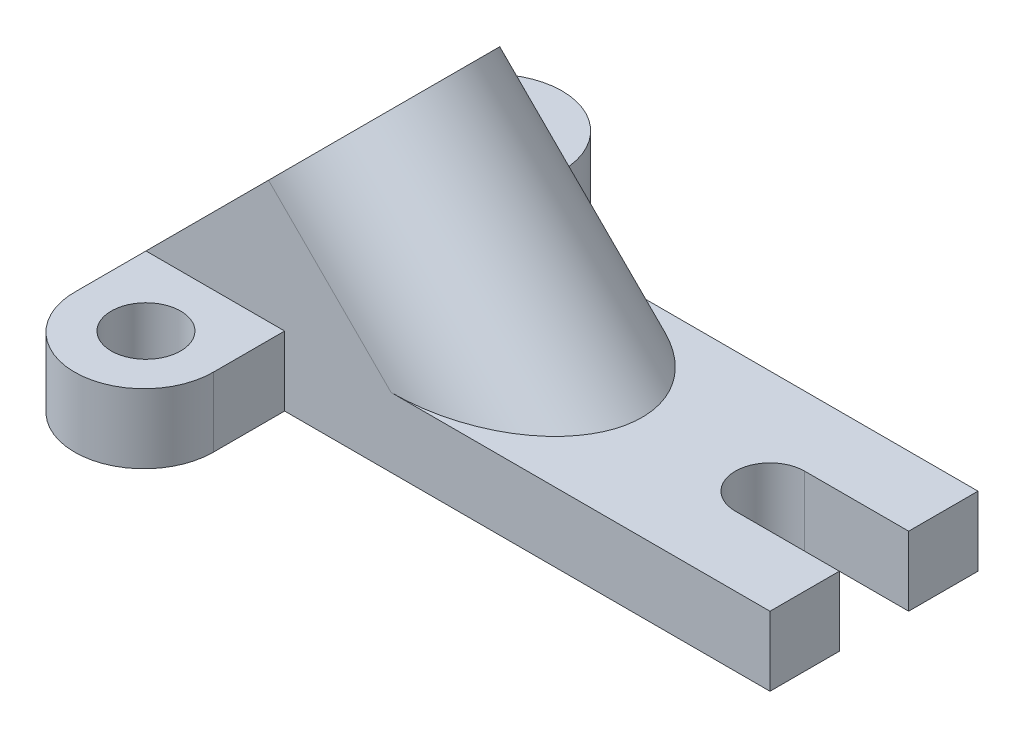
ISO-10303-21;
HEADER;
FILE_DESCRIPTION(('STEP AP214'),'2;1');
FILE_NAME('part.step','',(''),(''),'','','');
FILE_SCHEMA(('AUTOMOTIVE_DESIGN { 1 0 10303 214 1 1 1 1 }'));
ENDSEC;
DATA;
#1=APPLICATION_CONTEXT('core data for automotive mechanical design processes');
#2=APPLICATION_PROTOCOL_DEFINITION('international standard','automotive_design',2000,#1);
#3=PRODUCT_CONTEXT('',#1,'mechanical');
#4=PRODUCT('Part','Part','',(#3));
#5=PRODUCT_RELATED_PRODUCT_CATEGORY('part','',(#4));
#6=PRODUCT_DEFINITION_FORMATION('','',#4);
#7=PRODUCT_DEFINITION_CONTEXT('part definition',#1,'design');
#8=PRODUCT_DEFINITION('design','',#6,#7);
#9=PRODUCT_DEFINITION_SHAPE('','',#8);
#10=(LENGTH_UNIT() NAMED_UNIT(*) SI_UNIT(.MILLI.,.METRE.));
#11=(NAMED_UNIT(*) PLANE_ANGLE_UNIT() SI_UNIT($,.RADIAN.));
#12=(NAMED_UNIT(*) SI_UNIT($,.STERADIAN.) SOLID_ANGLE_UNIT());
#13=UNCERTAINTY_MEASURE_WITH_UNIT(LENGTH_MEASURE(1.E-05),#10,'distance_accuracy_value','');
#14=(GEOMETRIC_REPRESENTATION_CONTEXT(3) GLOBAL_UNCERTAINTY_ASSIGNED_CONTEXT((#13)) GLOBAL_UNIT_ASSIGNED_CONTEXT((#10,
#11,#12)) REPRESENTATION_CONTEXT('',''));
#15=CARTESIAN_POINT('',(0.,0.,0.));
#16=DIRECTION('',(0.,0.,1.));
#17=DIRECTION('',(1.,0.,0.));
#18=AXIS2_PLACEMENT_3D('',#15,#16,#17);
#19=CARTESIAN_POINT('',(140.,20.,-60.));
#20=DIRECTION('',(-1.,0.,0.));
#21=DIRECTION('',(0.,0.,1.));
#22=AXIS2_PLACEMENT_3D('',#19,#20,#21);
#23=PLANE('',#22);
#24=DIRECTION('',(0.,0.,-1.));
#25=VECTOR('',#24,1.);
#26=CARTESIAN_POINT('',(140.,0.,-60.));
#27=LINE('',#26,#25);
#28=CARTESIAN_POINT('',(140.,0.,0.));
#29=VERTEX_POINT('',#28);
#30=CARTESIAN_POINT('',(140.,0.,-20.));
#31=VERTEX_POINT('',#30);
#32=EDGE_CURVE('E173',#29,#31,#27,.T.);
#33=ORIENTED_EDGE('',*,*,#32,.T.);
#34=DIRECTION('',(0.,1.,0.));
#35=VECTOR('',#34,1.);
#36=CARTESIAN_POINT('',(140.,0.,-20.));
#37=LINE('',#36,#35);
#38=CARTESIAN_POINT('',(140.,20.,-20.));
#39=VERTEX_POINT('',#38);
#40=EDGE_CURVE('E157',#31,#39,#37,.T.);
#41=ORIENTED_EDGE('',*,*,#40,.T.);
#42=DIRECTION('',(0.,0.,-1.));
#43=VECTOR('',#42,1.);
#44=CARTESIAN_POINT('',(140.,20.,-60.));
#45=LINE('',#44,#43);
#46=CARTESIAN_POINT('',(140.,20.,0.));
#47=VERTEX_POINT('',#46);
#48=EDGE_CURVE('E277',#47,#39,#45,.T.);
#49=ORIENTED_EDGE('',*,*,#48,.F.);
#50=DIRECTION('',(0.,-1.,0.));
#51=VECTOR('',#50,1.);
#52=CARTESIAN_POINT('',(140.,20.,0.));
#53=LINE('',#52,#51);
#54=EDGE_CURVE('E181',#47,#29,#53,.T.);
#55=ORIENTED_EDGE('',*,*,#54,.T.);
#56=EDGE_LOOP('',(#33,#41,#49,#55));
#57=FACE_BOUND('',#56,.T.);
#58=ADVANCED_FACE('F47',(#57),#23,.F.);
#59=CARTESIAN_POINT('',(-20.0034741873056,20.,20.5636305457978));
#60=DIRECTION('',(0.,1.,0.));
#61=DIRECTION('',(0.,0.,1.));
#62=AXIS2_PLACEMENT_3D('',#59,#60,#61);
#63=PLANE('',#62);
#64=CARTESIAN_POINT('',(-19.9995037860271,20.,20.0000489442431));
#65=DIRECTION('',(0.,1.,0.));
#66=DIRECTION('',(0.,0.,1.));
#67=AXIS2_PLACEMENT_3D('',#64,#65,#66);
#68=CIRCLE('',#67,10.);
#69=CARTESIAN_POINT('',(-19.9995037860271,20.,30.0000489442431));
#70=VERTEX_POINT('',#69);
#71=EDGE_CURVE('E290',#70,#70,#68,.T.);
#72=ORIENTED_EDGE('',*,*,#71,.F.);
#73=EDGE_LOOP('',(#72));
#74=FACE_BOUND('',#73,.T.);
#75=DIRECTION('',(0.,0.,-1.));
#76=VECTOR('',#75,1.);
#77=CARTESIAN_POINT('',(0.,20.,0.));
#78=LINE('',#77,#76);
#79=CARTESIAN_POINT('',(0.,20.,20.5636305457978));
#80=VERTEX_POINT('',#79);
#81=CARTESIAN_POINT('',(0.,20.,0.));
#82=VERTEX_POINT('',#81);
#83=EDGE_CURVE('E207',#80,#82,#78,.T.);
#84=ORIENTED_EDGE('',*,*,#83,.T.);
#85=DIRECTION('',(-1.,0.,0.));
#86=VECTOR('',#85,1.);
#87=CARTESIAN_POINT('',(73.6406027347355,20.,0.));
#88=LINE('',#87,#86);
#89=CARTESIAN_POINT('',(-39.9990075720541,20.,0.));
#90=VERTEX_POINT('',#89);
#91=EDGE_CURVE('E11',#82,#90,#88,.T.);
#92=ORIENTED_EDGE('',*,*,#91,.T.);
#93=DIRECTION('',(0.,0.,1.));
#94=VECTOR('',#93,1.);
#95=CARTESIAN_POINT('',(-39.9990075720541,20.,-80.));
#96=LINE('',#95,#94);
#97=CARTESIAN_POINT('',(-39.9990075720541,20.,20.0000489442431));
#98=VERTEX_POINT('',#97);
#99=EDGE_CURVE('E266',#90,#98,#96,.T.);
#100=ORIENTED_EDGE('',*,*,#99,.T.);
#101=CARTESIAN_POINT('',(-20.0034741873056,20.,20.5636305457978));
#102=DIRECTION('',(0.,1.,0.));
#103=DIRECTION('',(0.,0.,1.));
#104=AXIS2_PLACEMENT_3D('',#101,#102,#103);
#105=CIRCLE('',#104,20.0034741873056);
#106=EDGE_CURVE('E213',#98,#80,#105,.T.);
#107=ORIENTED_EDGE('',*,*,#106,.T.);
#108=EDGE_LOOP('',(#84,#92,#100,#107));
#109=FACE_BOUND('',#108,.T.);
#110=ADVANCED_FACE('F465',(#74,#109),#63,.T.);
#111=CARTESIAN_POINT('',(-19.9995037860271,20.,-80.));
#112=DIRECTION('',(0.,1.,0.));
#113=DIRECTION('',(0.,0.,1.));
#114=AXIS2_PLACEMENT_3D('',#111,#112,#113);
#115=CIRCLE('',#114,10.);
#116=CARTESIAN_POINT('',(-19.9995037860271,20.,-70.));
#117=VERTEX_POINT('',#116);
#118=EDGE_CURVE('E257',#117,#117,#115,.T.);
#119=ORIENTED_EDGE('',*,*,#118,.F.);
#120=EDGE_LOOP('',(#119));
#121=FACE_BOUND('',#120,.T.);
#122=CARTESIAN_POINT('',(-39.9990075720541,20.,-80.));
#123=VERTEX_POINT('',#122);
#124=CARTESIAN_POINT('',(-39.9990075720541,20.,-60.));
#125=VERTEX_POINT('',#124);
#126=EDGE_CURVE('E262',#123,#125,#96,.T.);
#127=ORIENTED_EDGE('',*,*,#126,.T.);
#128=DIRECTION('',(1.,0.,0.));
#129=VECTOR('',#128,1.);
#130=CARTESIAN_POINT('',(73.6406027347355,20.,-60.));
#131=LINE('',#130,#129);
#132=CARTESIAN_POINT('',(0.,20.,-60.));
#133=VERTEX_POINT('',#132);
#134=EDGE_CURVE('E291',#125,#133,#131,.T.);
#135=ORIENTED_EDGE('',*,*,#134,.T.);
#136=DIRECTION('',(0.,0.,-1.));
#137=VECTOR('',#136,1.);
#138=CARTESIAN_POINT('',(0.,20.,-60.));
#139=LINE('',#138,#137);
#140=CARTESIAN_POINT('',(0.,20.,-80.));
#141=VERTEX_POINT('',#140);
#142=EDGE_CURVE('E270',#133,#141,#139,.T.);
#143=ORIENTED_EDGE('',*,*,#142,.T.);
#144=CARTESIAN_POINT('',(-19.9995037860271,20.,-80.));
#145=DIRECTION('',(0.,1.,0.));
#146=DIRECTION('',(0.,0.,-1.));
#147=AXIS2_PLACEMENT_3D('',#144,#145,#146);
#148=CIRCLE('',#147,19.9995037860271);
#149=EDGE_CURVE('E267',#141,#123,#148,.T.);
#150=ORIENTED_EDGE('',*,*,#149,.T.);
#151=EDGE_LOOP('',(#127,#135,#143,#150));
#152=FACE_BOUND('',#151,.T.);
#153=ADVANCED_FACE('F482',(#121,#152),#63,.T.);
#154=CARTESIAN_POINT('',(0.,20.,0.));
#155=DIRECTION('',(-1.,0.,0.));
#156=DIRECTION('',(0.,0.,1.));
#157=AXIS2_PLACEMENT_3D('',#154,#155,#156);
#158=PLANE('',#157);
#159=DIRECTION('',(0.,0.,-1.));
#160=VECTOR('',#159,1.);
#161=CARTESIAN_POINT('',(0.,0.,0.));
#162=LINE('',#161,#160);
#163=CARTESIAN_POINT('',(0.,0.,20.5636305457978));
#164=VERTEX_POINT('',#163);
#165=CARTESIAN_POINT('',(0.,0.,0.));
#166=VERTEX_POINT('',#165);
#167=EDGE_CURVE('E247',#164,#166,#162,.T.);
#168=ORIENTED_EDGE('',*,*,#167,.T.);
#169=DIRECTION('',(0.,-1.,0.));
#170=VECTOR('',#169,1.);
#171=CARTESIAN_POINT('',(0.,20.,0.));
#172=LINE('',#171,#170);
#173=EDGE_CURVE('E51',#82,#166,#172,.T.);
#174=ORIENTED_EDGE('',*,*,#173,.F.);
#175=ORIENTED_EDGE('',*,*,#83,.F.);
#176=DIRECTION('',(0.,-1.,0.));
#177=VECTOR('',#176,1.);
#178=CARTESIAN_POINT('',(0.,20.,20.5636305457978));
#179=LINE('',#178,#177);
#180=EDGE_CURVE('E208',#80,#164,#179,.T.);
#181=ORIENTED_EDGE('',*,*,#180,.T.);
#182=EDGE_LOOP('',(#168,#174,#175,#181));
#183=FACE_BOUND('',#182,.T.);
#184=ADVANCED_FACE('F49',(#183),#158,.F.);
#185=CARTESIAN_POINT('',(140.,20.,0.));
#186=DIRECTION('',(0.,0.,-1.));
#187=DIRECTION('',(-1.,0.,0.));
#188=AXIS2_PLACEMENT_3D('',#185,#186,#187);
#189=PLANE('',#188);
#190=DIRECTION('',(1.,0.,0.));
#191=VECTOR('',#190,1.);
#192=CARTESIAN_POINT('',(140.,0.,0.));
#193=LINE('',#192,#191);
#194=EDGE_CURVE('E192',#166,#29,#193,.T.);
#195=ORIENTED_EDGE('',*,*,#194,.T.);
#196=ORIENTED_EDGE('',*,*,#54,.F.);
#197=DIRECTION('',(1.,0.,0.));
#198=VECTOR('',#197,1.);
#199=CARTESIAN_POINT('',(140.,20.,0.));
#200=LINE('',#199,#198);
#201=CARTESIAN_POINT('',(30.7116705466007,20.,0.));
#202=VERTEX_POINT('',#201);
#203=EDGE_CURVE('E281',#202,#47,#200,.T.);
#204=ORIENTED_EDGE('',*,*,#203,.F.);
#205=DIRECTION('',(-0.707106781186549,0.707106781186546,0.));
#206=VECTOR('',#205,1.);
#207=CARTESIAN_POINT('',(108.995941794063,-58.2842712474618,0.));
#208=LINE('',#207,#206);
#209=CARTESIAN_POINT('',(-4.64366851272681,55.3553390593274,0.));
#210=VERTEX_POINT('',#209);
#211=EDGE_CURVE('E72',#202,#210,#208,.T.);
#212=ORIENTED_EDGE('',*,*,#211,.T.);
#213=DIRECTION('',(0.707106781186546,0.707106781186549,0.));
#214=VECTOR('',#213,1.);
#215=CARTESIAN_POINT('',(-39.9990075720541,20.,0.));
#216=LINE('',#215,#214);
#217=EDGE_CURVE('E301',#90,#210,#216,.T.);
#218=ORIENTED_EDGE('',*,*,#217,.F.);
#219=ORIENTED_EDGE('',*,*,#91,.F.);
#220=ORIENTED_EDGE('',*,*,#173,.T.);
#221=EDGE_LOOP('',(#195,#196,#204,#212,#218,#219,#220));
#222=FACE_BOUND('',#221,.T.);
#223=ADVANCED_FACE('F242',(#222),#189,.F.);
#224=CARTESIAN_POINT('',(140.,20.,-40.));
#225=VERTEX_POINT('',#224);
#226=CARTESIAN_POINT('',(140.,20.,-60.));
#227=VERTEX_POINT('',#226);
#228=EDGE_CURVE('E280',#225,#227,#45,.T.);
#229=ORIENTED_EDGE('',*,*,#228,.F.);
#230=DIRECTION('',(0.,1.,0.));
#231=VECTOR('',#230,1.);
#232=CARTESIAN_POINT('',(140.,0.,-40.));
#233=LINE('',#232,#231);
#234=CARTESIAN_POINT('',(140.,0.,-40.));
#235=VERTEX_POINT('',#234);
#236=EDGE_CURVE('E168',#235,#225,#233,.T.);
#237=ORIENTED_EDGE('',*,*,#236,.F.);
#238=CARTESIAN_POINT('',(140.,0.,-60.));
#239=VERTEX_POINT('',#238);
#240=EDGE_CURVE('E184',#235,#239,#27,.T.);
#241=ORIENTED_EDGE('',*,*,#240,.T.);
#242=DIRECTION('',(0.,-1.,0.));
#243=VECTOR('',#242,1.);
#244=CARTESIAN_POINT('',(140.,20.,-60.));
#245=LINE('',#244,#243);
#246=EDGE_CURVE('E229',#227,#239,#245,.T.);
#247=ORIENTED_EDGE('',*,*,#246,.F.);
#248=EDGE_LOOP('',(#229,#237,#241,#247));
#249=FACE_BOUND('',#248,.T.);
#250=ADVANCED_FACE('F362',(#249),#23,.F.);
#251=CARTESIAN_POINT('',(0.,20.,-60.));
#252=DIRECTION('',(0.,0.,1.));
#253=DIRECTION('',(1.,0.,0.));
#254=AXIS2_PLACEMENT_3D('',#251,#252,#253);
#255=PLANE('',#254);
#256=DIRECTION('',(-1.,0.,0.));
#257=VECTOR('',#256,1.);
#258=CARTESIAN_POINT('',(0.,0.,-60.));
#259=LINE('',#258,#257);
#260=CARTESIAN_POINT('',(0.,0.,-60.));
#261=VERTEX_POINT('',#260);
#262=EDGE_CURVE('E183',#239,#261,#259,.T.);
#263=ORIENTED_EDGE('',*,*,#262,.T.);
#264=DIRECTION('',(0.,-1.,0.));
#265=VECTOR('',#264,1.);
#266=CARTESIAN_POINT('',(0.,20.,-60.));
#267=LINE('',#266,#265);
#268=EDGE_CURVE('E225',#133,#261,#267,.T.);
#269=ORIENTED_EDGE('',*,*,#268,.F.);
#270=ORIENTED_EDGE('',*,*,#134,.F.);
#271=DIRECTION('',(-0.707106781186546,-0.707106781186549,0.));
#272=VECTOR('',#271,1.);
#273=CARTESIAN_POINT('',(-39.9990075720541,20.,-60.));
#274=LINE('',#273,#272);
#275=CARTESIAN_POINT('',(-4.6436685127268,55.3553390593274,-60.));
#276=VERTEX_POINT('',#275);
#277=EDGE_CURVE('E312',#276,#125,#274,.T.);
#278=ORIENTED_EDGE('',*,*,#277,.F.);
#279=DIRECTION('',(-0.707106781186549,0.707106781186546,0.));
#280=VECTOR('',#279,1.);
#281=CARTESIAN_POINT('',(108.995941794063,-58.2842712474618,-60.));
#282=LINE('',#281,#280);
#283=CARTESIAN_POINT('',(30.7116705466008,20.,-60.));
#284=VERTEX_POINT('',#283);
#285=EDGE_CURVE('E298',#284,#276,#282,.T.);
#286=ORIENTED_EDGE('',*,*,#285,.F.);
#287=DIRECTION('',(-1.,0.,0.));
#288=VECTOR('',#287,1.);
#289=CARTESIAN_POINT('',(0.,20.,-60.));
#290=LINE('',#289,#288);
#291=EDGE_CURVE('E273',#227,#284,#290,.T.);
#292=ORIENTED_EDGE('',*,*,#291,.F.);
#293=ORIENTED_EDGE('',*,*,#246,.T.);
#294=EDGE_LOOP('',(#263,#269,#270,#278,#286,#292,#293));
#295=FACE_BOUND('',#294,.T.);
#296=ADVANCED_FACE('F488',(#295),#255,.F.);
#297=CARTESIAN_POINT('',(0.,20.,-60.));
#298=DIRECTION('',(-1.,0.,0.));
#299=DIRECTION('',(0.,0.,1.));
#300=AXIS2_PLACEMENT_3D('',#297,#298,#299);
#301=PLANE('',#300);
#302=DIRECTION('',(0.,0.,-1.));
#303=VECTOR('',#302,1.);
#304=CARTESIAN_POINT('',(0.,0.,-60.));
#305=LINE('',#304,#303);
#306=CARTESIAN_POINT('',(0.,0.,-80.));
#307=VERTEX_POINT('',#306);
#308=EDGE_CURVE('E190',#261,#307,#305,.T.);
#309=ORIENTED_EDGE('',*,*,#308,.T.);
#310=DIRECTION('',(0.,-1.,0.));
#311=VECTOR('',#310,1.);
#312=CARTESIAN_POINT('',(0.,20.,-80.));
#313=LINE('',#312,#311);
#314=EDGE_CURVE('E221',#141,#307,#313,.T.);
#315=ORIENTED_EDGE('',*,*,#314,.F.);
#316=ORIENTED_EDGE('',*,*,#142,.F.);
#317=ORIENTED_EDGE('',*,*,#268,.T.);
#318=EDGE_LOOP('',(#309,#315,#316,#317));
#319=FACE_BOUND('',#318,.T.);
#320=ADVANCED_FACE('F486',(#319),#301,.F.);
#321=CARTESIAN_POINT('',(-19.9995037860271,20.,-80.));
#322=DIRECTION('',(0.,-1.,0.));
#323=DIRECTION('',(0.,0.,-1.));
#324=AXIS2_PLACEMENT_3D('',#321,#322,#323);
#325=CYLINDRICAL_SURFACE('',#324,19.9995037860271);
#326=CARTESIAN_POINT('',(-19.9995037860271,0.,-80.));
#327=DIRECTION('',(0.,1.,0.));
#328=DIRECTION('',(0.,0.,-1.));
#329=AXIS2_PLACEMENT_3D('',#326,#327,#328);
#330=CIRCLE('',#329,19.9995037860271);
#331=CARTESIAN_POINT('',(-39.9990075720541,0.,-80.));
#332=VERTEX_POINT('',#331);
#333=EDGE_CURVE('E198',#307,#332,#330,.T.);
#334=ORIENTED_EDGE('',*,*,#333,.T.);
#335=DIRECTION('',(0.,-1.,0.));
#336=VECTOR('',#335,1.);
#337=CARTESIAN_POINT('',(-39.9990075720541,20.,-80.));
#338=LINE('',#337,#336);
#339=EDGE_CURVE('E217',#123,#332,#338,.T.);
#340=ORIENTED_EDGE('',*,*,#339,.F.);
#341=ORIENTED_EDGE('',*,*,#149,.F.);
#342=ORIENTED_EDGE('',*,*,#314,.T.);
#343=EDGE_LOOP('',(#334,#340,#341,#342));
#344=FACE_BOUND('',#343,.T.);
#345=ADVANCED_FACE('F477',(#344),#325,.T.);
#346=CARTESIAN_POINT('',(-39.9990075720541,20.,-80.));
#347=DIRECTION('',(1.,0.,0.));
#348=DIRECTION('',(0.,0.,-1.));
#349=AXIS2_PLACEMENT_3D('',#346,#347,#348);
#350=PLANE('',#349);
#351=DIRECTION('',(0.,0.,1.));
#352=VECTOR('',#351,1.);
#353=CARTESIAN_POINT('',(-39.9990075720541,0.,-80.));
#354=LINE('',#353,#352);
#355=CARTESIAN_POINT('',(-39.9990075720541,0.,20.0000489442431));
#356=VERTEX_POINT('',#355);
#357=EDGE_CURVE('E201',#332,#356,#354,.T.);
#358=ORIENTED_EDGE('',*,*,#357,.T.);
#359=DIRECTION('',(0.,-1.,0.));
#360=VECTOR('',#359,1.);
#361=CARTESIAN_POINT('',(-39.9990075720541,20.,20.0000489442431));
#362=LINE('',#361,#360);
#363=EDGE_CURVE('E212',#98,#356,#362,.T.);
#364=ORIENTED_EDGE('',*,*,#363,.F.);
#365=ORIENTED_EDGE('',*,*,#99,.F.);
#366=DIRECTION('',(0.,0.,1.));
#367=VECTOR('',#366,1.);
#368=CARTESIAN_POINT('',(-39.9990075720541,20.,-60.));
#369=LINE('',#368,#367);
#370=EDGE_CURVE('E308',#125,#90,#369,.T.);
#371=ORIENTED_EDGE('',*,*,#370,.F.);
#372=ORIENTED_EDGE('',*,*,#126,.F.);
#373=ORIENTED_EDGE('',*,*,#339,.T.);
#374=EDGE_LOOP('',(#358,#364,#365,#371,#372,#373));
#375=FACE_BOUND('',#374,.T.);
#376=ADVANCED_FACE('F469',(#375),#350,.F.);
#377=CARTESIAN_POINT('',(-20.0034741873056,20.,20.5636305457978));
#378=DIRECTION('',(0.,-1.,0.));
#379=DIRECTION('',(0.,0.,-1.));
#380=AXIS2_PLACEMENT_3D('',#377,#378,#379);
#381=CYLINDRICAL_SURFACE('',#380,20.0034741873056);
#382=CARTESIAN_POINT('',(-20.0034741873056,0.,20.5636305457978));
#383=DIRECTION('',(0.,1.,0.));
#384=DIRECTION('',(0.,0.,1.));
#385=AXIS2_PLACEMENT_3D('',#382,#383,#384);
#386=CIRCLE('',#385,20.0034741873056);
#387=EDGE_CURVE('E204',#356,#164,#386,.T.);
#388=ORIENTED_EDGE('',*,*,#387,.T.);
#389=ORIENTED_EDGE('',*,*,#180,.F.);
#390=ORIENTED_EDGE('',*,*,#106,.F.);
#391=ORIENTED_EDGE('',*,*,#363,.T.);
#392=EDGE_LOOP('',(#388,#389,#390,#391));
#393=FACE_BOUND('',#392,.T.);
#394=ADVANCED_FACE('F472',(#393),#381,.T.);
#395=DIRECTION('',(1.,0.,0.));
#396=VECTOR('',#395,1.);
#397=CARTESIAN_POINT('',(140.,20.,-20.));
#398=LINE('',#397,#396);
#399=CARTESIAN_POINT('',(110.,20.,-20.));
#400=VERTEX_POINT('',#399);
#401=EDGE_CURVE('E162',#400,#39,#398,.T.);
#402=ORIENTED_EDGE('',*,*,#401,.F.);
#403=CARTESIAN_POINT('',(110.,20.,-30.));
#404=DIRECTION('',(0.,1.,0.));
#405=DIRECTION('',(0.,0.,-1.));
#406=AXIS2_PLACEMENT_3D('',#403,#404,#405);
#407=CIRCLE('',#406,10.);
#408=CARTESIAN_POINT('',(110.,20.,-40.));
#409=VERTEX_POINT('',#408);
#410=EDGE_CURVE('E177',#409,#400,#407,.T.);
#411=ORIENTED_EDGE('',*,*,#410,.F.);
#412=DIRECTION('',(-1.,0.,0.));
#413=VECTOR('',#412,1.);
#414=CARTESIAN_POINT('',(140.,20.,-40.));
#415=LINE('',#414,#413);
#416=EDGE_CURVE('E343',#225,#409,#415,.T.);
#417=ORIENTED_EDGE('',*,*,#416,.F.);
#418=ORIENTED_EDGE('',*,*,#228,.T.);
#419=ORIENTED_EDGE('',*,*,#291,.T.);
#420=CARTESIAN_POINT('',(30.7116705466007,20.,-30.));
#421=DIRECTION('',(0.,1.,0.));
#422=DIRECTION('',(-1.,0.,0.));
#423=AXIS2_PLACEMENT_3D('',#420,#421,#422);
#424=ELLIPSE('',#423,42.4264068711929,30.);
#425=EDGE_CURVE('E304',#284,#202,#424,.F.);
#426=ORIENTED_EDGE('',*,*,#425,.T.);
#427=ORIENTED_EDGE('',*,*,#203,.T.);
#428=ORIENTED_EDGE('',*,*,#48,.T.);
#429=EDGE_LOOP('',(#402,#411,#417,#418,#419,#426,#427,#428));
#430=FACE_BOUND('',#429,.T.);
#431=ADVANCED_FACE('F490',(#430),#63,.T.);
#432=CARTESIAN_POINT('',(-20.0034741873056,0.,20.5636305457978));
#433=DIRECTION('',(0.,1.,0.));
#434=DIRECTION('',(0.,0.,1.));
#435=AXIS2_PLACEMENT_3D('',#432,#433,#434);
#436=PLANE('',#435);
#437=CARTESIAN_POINT('',(50.7116705466008,0.,-30.));
#438=DIRECTION('',(0.,1.,0.));
#439=DIRECTION('',(-1.,0.,0.));
#440=AXIS2_PLACEMENT_3D('',#437,#438,#439);
#441=ELLIPSE('',#440,21.2132034355965,15.);
#442=CARTESIAN_POINT('',(29.4984671110043,0.,-30.));
#443=VERTEX_POINT('',#442);
#444=EDGE_CURVE('E319',#443,#443,#441,.F.);
#445=ORIENTED_EDGE('',*,*,#444,.F.);
#446=EDGE_LOOP('',(#445));
#447=FACE_BOUND('',#446,.T.);
#448=CARTESIAN_POINT('',(-19.9995037860271,0.,-80.));
#449=DIRECTION('',(0.,1.,0.));
#450=DIRECTION('',(0.,0.,1.));
#451=AXIS2_PLACEMENT_3D('',#448,#449,#450);
#452=CIRCLE('',#451,10.);
#453=CARTESIAN_POINT('',(-19.9995037860271,0.,-70.));
#454=VERTEX_POINT('',#453);
#455=EDGE_CURVE('E251',#454,#454,#452,.T.);
#456=ORIENTED_EDGE('',*,*,#455,.T.);
#457=EDGE_LOOP('',(#456));
#458=FACE_BOUND('',#457,.T.);
#459=CARTESIAN_POINT('',(-19.9995037860271,0.,20.0000489442431));
#460=DIRECTION('',(0.,1.,0.));
#461=DIRECTION('',(0.,0.,1.));
#462=AXIS2_PLACEMENT_3D('',#459,#460,#461);
#463=CIRCLE('',#462,10.);
#464=CARTESIAN_POINT('',(-19.9995037860271,0.,30.0000489442431));
#465=VERTEX_POINT('',#464);
#466=EDGE_CURVE('E286',#465,#465,#463,.T.);
#467=ORIENTED_EDGE('',*,*,#466,.T.);
#468=EDGE_LOOP('',(#467));
#469=FACE_BOUND('',#468,.T.);
#470=CARTESIAN_POINT('',(110.,0.,-30.));
#471=DIRECTION('',(0.,1.,0.));
#472=DIRECTION('',(0.,0.,-1.));
#473=AXIS2_PLACEMENT_3D('',#470,#471,#472);
#474=CIRCLE('',#473,10.);
#475=CARTESIAN_POINT('',(110.,0.,-40.));
#476=VERTEX_POINT('',#475);
#477=CARTESIAN_POINT('',(110.,0.,-20.));
#478=VERTEX_POINT('',#477);
#479=EDGE_CURVE('E64',#476,#478,#474,.T.);
#480=ORIENTED_EDGE('',*,*,#479,.T.);
#481=DIRECTION('',(1.,0.,0.));
#482=VECTOR('',#481,1.);
#483=CARTESIAN_POINT('',(140.,0.,-20.));
#484=LINE('',#483,#482);
#485=EDGE_CURVE('E160',#478,#31,#484,.T.);
#486=ORIENTED_EDGE('',*,*,#485,.T.);
#487=ORIENTED_EDGE('',*,*,#32,.F.);
#488=ORIENTED_EDGE('',*,*,#194,.F.);
#489=ORIENTED_EDGE('',*,*,#167,.F.);
#490=ORIENTED_EDGE('',*,*,#387,.F.);
#491=ORIENTED_EDGE('',*,*,#357,.F.);
#492=ORIENTED_EDGE('',*,*,#333,.F.);
#493=ORIENTED_EDGE('',*,*,#308,.F.);
#494=ORIENTED_EDGE('',*,*,#262,.F.);
#495=ORIENTED_EDGE('',*,*,#240,.F.);
#496=DIRECTION('',(-1.,0.,0.));
#497=VECTOR('',#496,1.);
#498=CARTESIAN_POINT('',(140.,0.,-40.));
#499=LINE('',#498,#497);
#500=EDGE_CURVE('E176',#235,#476,#499,.T.);
#501=ORIENTED_EDGE('',*,*,#500,.T.);
#502=EDGE_LOOP('',(#480,#486,#487,#488,#489,#490,#491,#492,#493,#494,#495,#501));
#503=FACE_BOUND('',#502,.T.);
#504=ADVANCED_FACE('F172',(#447,#458,#469,#503),#436,.F.);
#505=CARTESIAN_POINT('',(-19.9995037860271,0.,20.0000489442431));
#506=DIRECTION('',(0.,1.,0.));
#507=DIRECTION('',(0.,0.,1.));
#508=AXIS2_PLACEMENT_3D('',#505,#506,#507);
#509=CYLINDRICAL_SURFACE('',#508,10.);
#510=ORIENTED_EDGE('',*,*,#466,.F.);
#511=EDGE_LOOP('',(#510));
#512=FACE_BOUND('',#511,.T.);
#513=ORIENTED_EDGE('',*,*,#71,.T.);
#514=EDGE_LOOP('',(#513));
#515=FACE_BOUND('',#514,.T.);
#516=ADVANCED_FACE('F533',(#512,#515),#509,.F.);
#517=CARTESIAN_POINT('',(-19.9995037860271,0.,-80.));
#518=DIRECTION('',(0.,1.,0.));
#519=DIRECTION('',(0.,0.,1.));
#520=AXIS2_PLACEMENT_3D('',#517,#518,#519);
#521=CYLINDRICAL_SURFACE('',#520,10.);
#522=ORIENTED_EDGE('',*,*,#455,.F.);
#523=EDGE_LOOP('',(#522));
#524=FACE_BOUND('',#523,.T.);
#525=ORIENTED_EDGE('',*,*,#118,.T.);
#526=EDGE_LOOP('',(#525));
#527=FACE_BOUND('',#526,.T.);
#528=ADVANCED_FACE('F573',(#524,#527),#521,.F.);
#529=CARTESIAN_POINT('',(-4.64366851272683,55.3553390593274,-30.));
#530=DIRECTION('',(0.707106781186549,-0.707106781186546,0.));
#531=DIRECTION('',(0.707106781186546,0.707106781186549,0.));
#532=AXIS2_PLACEMENT_3D('',#529,#530,#531);
#533=PLANE('',#532);
#534=CARTESIAN_POINT('',(-4.64366851272682,55.3553390593274,-30.));
#535=DIRECTION('',(-0.707106781186549,0.707106781186546,0.));
#536=DIRECTION('',(-0.707106781186546,-0.707106781186549,0.));
#537=AXIS2_PLACEMENT_3D('',#534,#535,#536);
#538=CIRCLE('',#537,15.);
#539=CARTESIAN_POINT('',(-15.250270230525,44.7487373415292,-30.));
#540=VERTEX_POINT('',#539);
#541=EDGE_CURVE('E328',#540,#540,#538,.T.);
#542=ORIENTED_EDGE('',*,*,#541,.F.);
#543=EDGE_LOOP('',(#542));
#544=FACE_BOUND('',#543,.T.);
#545=CARTESIAN_POINT('',(-4.64366851272683,55.3553390593274,-30.));
#546=DIRECTION('',(-0.707106781186549,0.707106781186546,0.));
#547=DIRECTION('',(0.707106781186546,0.707106781186549,0.));
#548=AXIS2_PLACEMENT_3D('',#545,#546,#547);
#549=CIRCLE('',#548,30.);
#550=EDGE_CURVE('E316',#210,#276,#549,.T.);
#551=ORIENTED_EDGE('',*,*,#550,.T.);
#552=ORIENTED_EDGE('',*,*,#277,.T.);
#553=ORIENTED_EDGE('',*,*,#370,.T.);
#554=ORIENTED_EDGE('',*,*,#217,.T.);
#555=EDGE_LOOP('',(#551,#552,#553,#554));
#556=FACE_BOUND('',#555,.T.);
#557=ADVANCED_FACE('F565',(#544,#556),#533,.F.);
#558=CARTESIAN_POINT('',(108.995941794063,-58.2842712474618,-30.));
#559=DIRECTION('',(-0.707106781186549,0.707106781186546,0.));
#560=DIRECTION('',(-0.707106781186546,-0.707106781186549,0.));
#561=AXIS2_PLACEMENT_3D('',#558,#559,#560);
#562=CYLINDRICAL_SURFACE('',#561,30.);
#563=ORIENTED_EDGE('',*,*,#425,.F.);
#564=ORIENTED_EDGE('',*,*,#285,.T.);
#565=ORIENTED_EDGE('',*,*,#550,.F.);
#566=ORIENTED_EDGE('',*,*,#211,.F.);
#567=EDGE_LOOP('',(#563,#564,#565,#566));
#568=FACE_BOUND('',#567,.T.);
#569=ADVANCED_FACE('F561',(#568),#562,.T.);
#570=CARTESIAN_POINT('',(86.9248739821973,-36.2132034355964,-30.));
#571=DIRECTION('',(-0.707106781186549,0.707106781186546,0.));
#572=DIRECTION('',(-0.707106781186546,-0.707106781186549,0.));
#573=AXIS2_PLACEMENT_3D('',#570,#571,#572);
#574=CYLINDRICAL_SURFACE('',#573,15.);
#575=ORIENTED_EDGE('',*,*,#444,.T.);
#576=EDGE_LOOP('',(#575));
#577=FACE_BOUND('',#576,.T.);
#578=ORIENTED_EDGE('',*,*,#541,.T.);
#579=EDGE_LOOP('',(#578));
#580=FACE_BOUND('',#579,.T.);
#581=ADVANCED_FACE('F501',(#577,#580),#574,.F.);
#582=CARTESIAN_POINT('',(140.,0.,-20.));
#583=DIRECTION('',(0.,0.,1.));
#584=DIRECTION('',(1.,0.,0.));
#585=AXIS2_PLACEMENT_3D('',#582,#583,#584);
#586=PLANE('',#585);
#587=ORIENTED_EDGE('',*,*,#401,.T.);
#588=ORIENTED_EDGE('',*,*,#40,.F.);
#589=ORIENTED_EDGE('',*,*,#485,.F.);
#590=DIRECTION('',(0.,1.,0.));
#591=VECTOR('',#590,1.);
#592=CARTESIAN_POINT('',(110.,0.,-20.));
#593=LINE('',#592,#591);
#594=EDGE_CURVE('E331',#478,#400,#593,.T.);
#595=ORIENTED_EDGE('',*,*,#594,.T.);
#596=EDGE_LOOP('',(#587,#588,#589,#595));
#597=FACE_BOUND('',#596,.T.);
#598=ADVANCED_FACE('F159',(#597),#586,.F.);
#599=CARTESIAN_POINT('',(110.,0.,-30.));
#600=DIRECTION('',(0.,1.,0.));
#601=DIRECTION('',(0.,0.,1.));
#602=AXIS2_PLACEMENT_3D('',#599,#600,#601);
#603=CYLINDRICAL_SURFACE('',#602,10.);
#604=ORIENTED_EDGE('',*,*,#410,.T.);
#605=ORIENTED_EDGE('',*,*,#594,.F.);
#606=ORIENTED_EDGE('',*,*,#479,.F.);
#607=DIRECTION('',(0.,1.,0.));
#608=VECTOR('',#607,1.);
#609=CARTESIAN_POINT('',(110.,0.,-40.));
#610=LINE('',#609,#608);
#611=EDGE_CURVE('E335',#476,#409,#610,.T.);
#612=ORIENTED_EDGE('',*,*,#611,.T.);
#613=EDGE_LOOP('',(#604,#605,#606,#612));
#614=FACE_BOUND('',#613,.T.);
#615=ADVANCED_FACE('F493',(#614),#603,.F.);
#616=CARTESIAN_POINT('',(140.,0.,-40.));
#617=DIRECTION('',(0.,0.,-1.));
#618=DIRECTION('',(-1.,0.,0.));
#619=AXIS2_PLACEMENT_3D('',#616,#617,#618);
#620=PLANE('',#619);
#621=ORIENTED_EDGE('',*,*,#416,.T.);
#622=ORIENTED_EDGE('',*,*,#611,.F.);
#623=ORIENTED_EDGE('',*,*,#500,.F.);
#624=ORIENTED_EDGE('',*,*,#236,.T.);
#625=EDGE_LOOP('',(#621,#622,#623,#624));
#626=FACE_BOUND('',#625,.T.);
#627=ADVANCED_FACE('F358',(#626),#620,.F.);
#628=CLOSED_SHELL('',(#58,#110,#153,#184,#223,#250,#296,#320,#345,#376,#394,#431,#504,#516,#528,
#557,#569,#581,#598,#615,#627));
#629=MANIFOLD_SOLID_BREP('B2',#628);
#630=ADVANCED_BREP_SHAPE_REPRESENTATION('',(#18,#629),#14);
#631=SHAPE_DEFINITION_REPRESENTATION(#9,#630);
ENDSEC;
END-ISO-10303-21;
